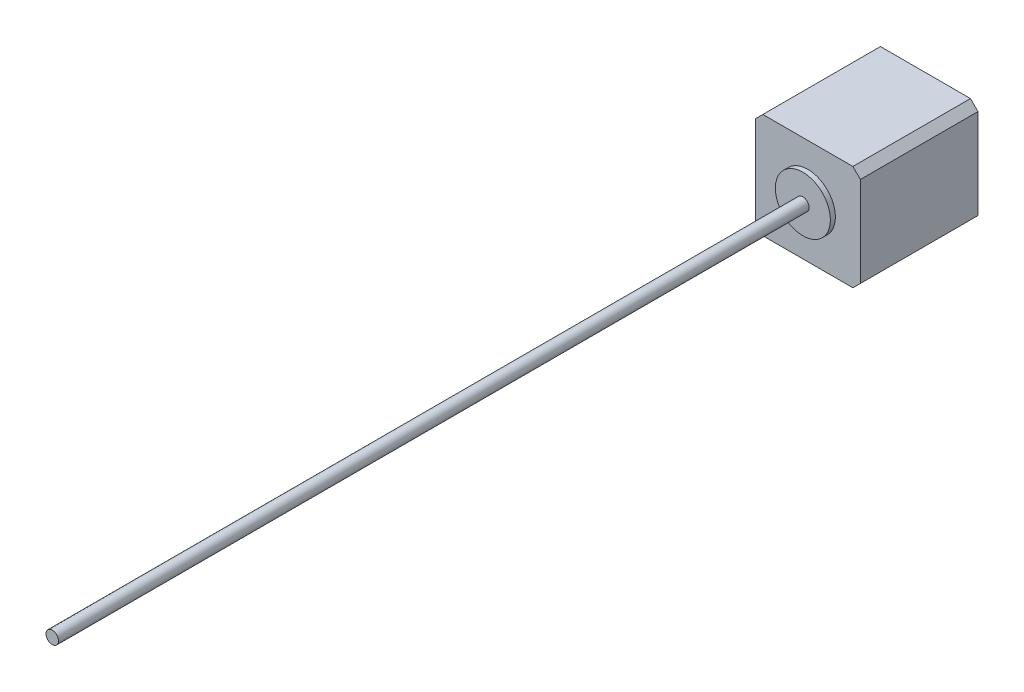
ISO-10303-21;
HEADER;
FILE_DESCRIPTION(('STEP AP214'),'2;1');
FILE_NAME('part.step','',(''),(''),'','','');
FILE_SCHEMA(('AUTOMOTIVE_DESIGN { 1 0 10303 214 1 1 1 1 }'));
ENDSEC;
DATA;
#1=APPLICATION_CONTEXT('core data for automotive mechanical design processes');
#2=APPLICATION_PROTOCOL_DEFINITION('international standard','automotive_design',2000,#1);
#3=PRODUCT_CONTEXT('',#1,'mechanical');
#4=PRODUCT('Part','Part','',(#3));
#5=PRODUCT_RELATED_PRODUCT_CATEGORY('part','',(#4));
#6=PRODUCT_DEFINITION_FORMATION('','',#4);
#7=PRODUCT_DEFINITION_CONTEXT('part definition',#1,'design');
#8=PRODUCT_DEFINITION('design','',#6,#7);
#9=PRODUCT_DEFINITION_SHAPE('','',#8);
#10=(LENGTH_UNIT() NAMED_UNIT(*) SI_UNIT(.MILLI.,.METRE.));
#11=(NAMED_UNIT(*) PLANE_ANGLE_UNIT() SI_UNIT($,.RADIAN.));
#12=(NAMED_UNIT(*) SI_UNIT($,.STERADIAN.) SOLID_ANGLE_UNIT());
#13=UNCERTAINTY_MEASURE_WITH_UNIT(LENGTH_MEASURE(1.E-05),#10,'distance_accuracy_value','');
#14=(GEOMETRIC_REPRESENTATION_CONTEXT(3) GLOBAL_UNCERTAINTY_ASSIGNED_CONTEXT((#13)) GLOBAL_UNIT_ASSIGNED_CONTEXT((#10,
#11,#12)) REPRESENTATION_CONTEXT('',''));
#15=CARTESIAN_POINT('',(0.,0.,0.));
#16=DIRECTION('',(0.,0.,1.));
#17=DIRECTION('',(1.,0.,0.));
#18=AXIS2_PLACEMENT_3D('',#15,#16,#17);
#19=CARTESIAN_POINT('',(-21.,21.,49.));
#20=DIRECTION('',(0.,0.,1.));
#21=DIRECTION('',(1.,0.,0.));
#22=AXIS2_PLACEMENT_3D('',#19,#20,#21);
#23=PLANE('',#22);
#24=CARTESIAN_POINT('',(-21.,21.,49.));
#25=DIRECTION('',(0.,0.,1.));
#26=DIRECTION('',(1.,0.,0.));
#27=AXIS2_PLACEMENT_3D('',#24,#25,#26);
#28=CIRCLE('',#27,11.);
#29=CARTESIAN_POINT('',(-10.,21.,49.));
#30=VERTEX_POINT('',#29);
#31=EDGE_CURVE('E161',#30,#30,#28,.T.);
#32=ORIENTED_EDGE('',*,*,#31,.T.);
#33=EDGE_LOOP('',(#32));
#34=FACE_BOUND('',#33,.T.);
#35=CARTESIAN_POINT('',(-21.,21.,49.));
#36=DIRECTION('',(0.,0.,1.));
#37=DIRECTION('',(1.,0.,0.));
#38=AXIS2_PLACEMENT_3D('',#35,#36,#37);
#39=CIRCLE('',#38,2.5);
#40=CARTESIAN_POINT('',(-18.5,21.,49.));
#41=VERTEX_POINT('',#40);
#42=EDGE_CURVE('E175',#41,#41,#39,.T.);
#43=ORIENTED_EDGE('',*,*,#42,.F.);
#44=EDGE_LOOP('',(#43));
#45=FACE_BOUND('',#44,.T.);
#46=ADVANCED_FACE('F35',(#34,#45),#23,.T.);
#47=CARTESIAN_POINT('',(0.,0.,47.));
#48=DIRECTION('',(0.,0.,1.));
#49=DIRECTION('',(1.,0.,0.));
#50=AXIS2_PLACEMENT_3D('',#47,#48,#49);
#51=PLANE('',#50);
#52=DIRECTION('',(0.,-1.,0.));
#53=VECTOR('',#52,1.);
#54=CARTESIAN_POINT('',(-42.,0.,47.));
#55=LINE('',#54,#53);
#56=CARTESIAN_POINT('',(-42.,39.,47.));
#57=VERTEX_POINT('',#56);
#58=CARTESIAN_POINT('',(-42.,3.00000000000001,47.));
#59=VERTEX_POINT('',#58);
#60=EDGE_CURVE('E165',#57,#59,#55,.T.);
#61=ORIENTED_EDGE('',*,*,#60,.T.);
#62=DIRECTION('',(-0.707106781186545,0.70710678118655,0.));
#63=VECTOR('',#62,1.);
#64=CARTESIAN_POINT('',(-19.5000000000001,-19.5,47.));
#65=LINE('',#64,#63);
#66=CARTESIAN_POINT('',(-39.,0.,47.));
#67=VERTEX_POINT('',#66);
#68=EDGE_CURVE('E148',#59,#67,#65,.F.);
#69=ORIENTED_EDGE('',*,*,#68,.T.);
#70=DIRECTION('',(1.,0.,0.));
#71=VECTOR('',#70,1.);
#72=CARTESIAN_POINT('',(0.,0.,47.));
#73=LINE('',#72,#71);
#74=CARTESIAN_POINT('',(-3.00000000000001,0.,47.));
#75=VERTEX_POINT('',#74);
#76=EDGE_CURVE('E120',#67,#75,#73,.T.);
#77=ORIENTED_EDGE('',*,*,#76,.T.);
#78=DIRECTION('',(-0.70710678118655,-0.707106781186545,0.));
#79=VECTOR('',#78,1.);
#80=CARTESIAN_POINT('',(-1.49999999999999,1.5,47.));
#81=LINE('',#80,#79);
#82=CARTESIAN_POINT('',(0.,2.99999999999999,47.));
#83=VERTEX_POINT('',#82);
#84=EDGE_CURVE('E146',#75,#83,#81,.F.);
#85=ORIENTED_EDGE('',*,*,#84,.T.);
#86=DIRECTION('',(0.,1.,0.));
#87=VECTOR('',#86,1.);
#88=CARTESIAN_POINT('',(0.,0.,47.));
#89=LINE('',#88,#87);
#90=CARTESIAN_POINT('',(0.,39.,47.));
#91=VERTEX_POINT('',#90);
#92=EDGE_CURVE('E126',#83,#91,#89,.T.);
#93=ORIENTED_EDGE('',*,*,#92,.T.);
#94=DIRECTION('',(0.707106781186546,-0.707106781186549,0.));
#95=VECTOR('',#94,1.);
#96=CARTESIAN_POINT('',(19.5,19.4999999999999,47.));
#97=LINE('',#96,#95);
#98=CARTESIAN_POINT('',(-3.,42.,47.));
#99=VERTEX_POINT('',#98);
#100=EDGE_CURVE('E55',#91,#99,#97,.F.);
#101=ORIENTED_EDGE('',*,*,#100,.T.);
#102=DIRECTION('',(-1.,0.,0.));
#103=VECTOR('',#102,1.);
#104=CARTESIAN_POINT('',(0.,42.,47.));
#105=LINE('',#104,#103);
#106=CARTESIAN_POINT('',(-39.,42.,47.));
#107=VERTEX_POINT('',#106);
#108=EDGE_CURVE('E129',#99,#107,#105,.T.);
#109=ORIENTED_EDGE('',*,*,#108,.T.);
#110=DIRECTION('',(0.707106781186551,0.707106781186544,0.));
#111=VECTOR('',#110,1.);
#112=CARTESIAN_POINT('',(-40.4999999999998,40.5000000000002,47.));
#113=LINE('',#112,#111);
#114=EDGE_CURVE('E144',#107,#57,#113,.F.);
#115=ORIENTED_EDGE('',*,*,#114,.T.);
#116=EDGE_LOOP('',(#61,#69,#77,#85,#93,#101,#109,#115));
#117=FACE_BOUND('',#116,.T.);
#118=CARTESIAN_POINT('',(-21.,21.,47.));
#119=DIRECTION('',(0.,0.,1.));
#120=DIRECTION('',(1.,0.,0.));
#121=AXIS2_PLACEMENT_3D('',#118,#119,#120);
#122=CIRCLE('',#121,11.);
#123=CARTESIAN_POINT('',(-10.,21.,47.));
#124=VERTEX_POINT('',#123);
#125=EDGE_CURVE('E169',#124,#124,#122,.T.);
#126=ORIENTED_EDGE('',*,*,#125,.F.);
#127=EDGE_LOOP('',(#126));
#128=FACE_BOUND('',#127,.T.);
#129=ADVANCED_FACE('F191',(#117,#128),#51,.T.);
#130=CARTESIAN_POINT('',(0.,0.,47.));
#131=DIRECTION('',(-1.,0.,0.));
#132=DIRECTION('',(0.,0.,1.));
#133=AXIS2_PLACEMENT_3D('',#130,#131,#132);
#134=PLANE('',#133);
#135=ORIENTED_EDGE('',*,*,#92,.F.);
#136=DIRECTION('',(0.,0.,-1.));
#137=VECTOR('',#136,1.);
#138=CARTESIAN_POINT('',(0.,2.99999999999999,47.));
#139=LINE('',#138,#137);
#140=CARTESIAN_POINT('',(0.,2.99999999999999,0.));
#141=VERTEX_POINT('',#140);
#142=EDGE_CURVE('E152',#83,#141,#139,.T.);
#143=ORIENTED_EDGE('',*,*,#142,.T.);
#144=DIRECTION('',(0.,1.,0.));
#145=VECTOR('',#144,1.);
#146=CARTESIAN_POINT('',(0.,0.,0.));
#147=LINE('',#146,#145);
#148=CARTESIAN_POINT('',(0.,39.,0.));
#149=VERTEX_POINT('',#148);
#150=EDGE_CURVE('E160',#141,#149,#147,.T.);
#151=ORIENTED_EDGE('',*,*,#150,.T.);
#152=DIRECTION('',(0.,0.,1.));
#153=VECTOR('',#152,1.);
#154=CARTESIAN_POINT('',(0.,39.,47.));
#155=LINE('',#154,#153);
#156=EDGE_CURVE('E150',#149,#91,#155,.T.);
#157=ORIENTED_EDGE('',*,*,#156,.T.);
#158=EDGE_LOOP('',(#135,#143,#151,#157));
#159=FACE_BOUND('',#158,.T.);
#160=ADVANCED_FACE('F197',(#159),#134,.F.);
#161=CARTESIAN_POINT('',(0.,42.,47.));
#162=DIRECTION('',(0.,-1.,0.));
#163=DIRECTION('',(0.,0.,-1.));
#164=AXIS2_PLACEMENT_3D('',#161,#162,#163);
#165=PLANE('',#164);
#166=DIRECTION('',(-1.,0.,0.));
#167=VECTOR('',#166,1.);
#168=CARTESIAN_POINT('',(0.,42.,0.));
#169=LINE('',#168,#167);
#170=CARTESIAN_POINT('',(-3.,42.,0.));
#171=VERTEX_POINT('',#170);
#172=CARTESIAN_POINT('',(-39.,42.,0.));
#173=VERTEX_POINT('',#172);
#174=EDGE_CURVE('E131',#171,#173,#169,.T.);
#175=ORIENTED_EDGE('',*,*,#174,.T.);
#176=DIRECTION('',(0.,0.,1.));
#177=VECTOR('',#176,1.);
#178=CARTESIAN_POINT('',(-39.,42.,47.));
#179=LINE('',#178,#177);
#180=EDGE_CURVE('E11',#173,#107,#179,.T.);
#181=ORIENTED_EDGE('',*,*,#180,.T.);
#182=ORIENTED_EDGE('',*,*,#108,.F.);
#183=DIRECTION('',(0.,0.,-1.));
#184=VECTOR('',#183,1.);
#185=CARTESIAN_POINT('',(-3.,42.,47.));
#186=LINE('',#185,#184);
#187=EDGE_CURVE('E43',#99,#171,#186,.T.);
#188=ORIENTED_EDGE('',*,*,#187,.T.);
#189=EDGE_LOOP('',(#175,#181,#182,#188));
#190=FACE_BOUND('',#189,.T.);
#191=ADVANCED_FACE('F157',(#190),#165,.F.);
#192=CARTESIAN_POINT('',(-42.,0.,47.));
#193=DIRECTION('',(1.,0.,0.));
#194=DIRECTION('',(0.,0.,-1.));
#195=AXIS2_PLACEMENT_3D('',#192,#193,#194);
#196=PLANE('',#195);
#197=DIRECTION('',(0.,-1.,0.));
#198=VECTOR('',#197,1.);
#199=CARTESIAN_POINT('',(-42.,0.,0.));
#200=LINE('',#199,#198);
#201=CARTESIAN_POINT('',(-42.,39.,0.));
#202=VERTEX_POINT('',#201);
#203=CARTESIAN_POINT('',(-42.,3.00000000000001,0.));
#204=VERTEX_POINT('',#203);
#205=EDGE_CURVE('E127',#202,#204,#200,.T.);
#206=ORIENTED_EDGE('',*,*,#205,.T.);
#207=DIRECTION('',(0.,0.,1.));
#208=VECTOR('',#207,1.);
#209=CARTESIAN_POINT('',(-42.,3.00000000000001,47.));
#210=LINE('',#209,#208);
#211=EDGE_CURVE('E105',#204,#59,#210,.T.);
#212=ORIENTED_EDGE('',*,*,#211,.T.);
#213=ORIENTED_EDGE('',*,*,#60,.F.);
#214=DIRECTION('',(0.,0.,-1.));
#215=VECTOR('',#214,1.);
#216=CARTESIAN_POINT('',(-42.,39.,47.));
#217=LINE('',#216,#215);
#218=EDGE_CURVE('E110',#57,#202,#217,.T.);
#219=ORIENTED_EDGE('',*,*,#218,.T.);
#220=EDGE_LOOP('',(#206,#212,#213,#219));
#221=FACE_BOUND('',#220,.T.);
#222=ADVANCED_FACE('F208',(#221),#196,.F.);
#223=CARTESIAN_POINT('',(0.,0.,47.));
#224=DIRECTION('',(0.,1.,0.));
#225=DIRECTION('',(-1.,0.,0.));
#226=AXIS2_PLACEMENT_3D('',#223,#224,#225);
#227=PLANE('',#226);
#228=ORIENTED_EDGE('',*,*,#76,.F.);
#229=DIRECTION('',(0.,0.,-1.));
#230=VECTOR('',#229,1.);
#231=CARTESIAN_POINT('',(-39.,0.,47.));
#232=LINE('',#231,#230);
#233=CARTESIAN_POINT('',(-39.,0.,0.));
#234=VERTEX_POINT('',#233);
#235=EDGE_CURVE('E104',#67,#234,#232,.T.);
#236=ORIENTED_EDGE('',*,*,#235,.T.);
#237=DIRECTION('',(1.,0.,0.));
#238=VECTOR('',#237,1.);
#239=CARTESIAN_POINT('',(0.,0.,0.));
#240=LINE('',#239,#238);
#241=CARTESIAN_POINT('',(-3.00000000000001,0.,0.));
#242=VERTEX_POINT('',#241);
#243=EDGE_CURVE('E117',#234,#242,#240,.T.);
#244=ORIENTED_EDGE('',*,*,#243,.T.);
#245=DIRECTION('',(0.,0.,1.));
#246=VECTOR('',#245,1.);
#247=CARTESIAN_POINT('',(-3.00000000000001,0.,47.));
#248=LINE('',#247,#246);
#249=EDGE_CURVE('E122',#242,#75,#248,.T.);
#250=ORIENTED_EDGE('',*,*,#249,.T.);
#251=EDGE_LOOP('',(#228,#236,#244,#250));
#252=FACE_BOUND('',#251,.T.);
#253=ADVANCED_FACE('F116',(#252),#227,.F.);
#254=CARTESIAN_POINT('',(0.,0.,0.));
#255=DIRECTION('',(0.,0.,1.));
#256=DIRECTION('',(1.,0.,0.));
#257=AXIS2_PLACEMENT_3D('',#254,#255,#256);
#258=PLANE('',#257);
#259=ORIENTED_EDGE('',*,*,#243,.F.);
#260=DIRECTION('',(0.707106781186545,-0.70710678118655,0.));
#261=VECTOR('',#260,1.);
#262=CARTESIAN_POINT('',(-39.,0.,0.));
#263=LINE('',#262,#261);
#264=EDGE_CURVE('E100',#234,#204,#263,.F.);
#265=ORIENTED_EDGE('',*,*,#264,.T.);
#266=ORIENTED_EDGE('',*,*,#205,.F.);
#267=DIRECTION('',(-0.707106781186551,-0.707106781186544,0.));
#268=VECTOR('',#267,1.);
#269=CARTESIAN_POINT('',(-42.,39.,0.));
#270=LINE('',#269,#268);
#271=EDGE_CURVE('E137',#202,#173,#270,.F.);
#272=ORIENTED_EDGE('',*,*,#271,.T.);
#273=ORIENTED_EDGE('',*,*,#174,.F.);
#274=DIRECTION('',(-0.707106781186546,0.707106781186549,0.));
#275=VECTOR('',#274,1.);
#276=CARTESIAN_POINT('',(-3.,42.,0.));
#277=LINE('',#276,#275);
#278=EDGE_CURVE('E121',#171,#149,#277,.F.);
#279=ORIENTED_EDGE('',*,*,#278,.T.);
#280=ORIENTED_EDGE('',*,*,#150,.F.);
#281=DIRECTION('',(0.70710678118655,0.707106781186545,0.));
#282=VECTOR('',#281,1.);
#283=CARTESIAN_POINT('',(0.,2.99999999999999,0.));
#284=LINE('',#283,#282);
#285=EDGE_CURVE('E111',#141,#242,#284,.F.);
#286=ORIENTED_EDGE('',*,*,#285,.T.);
#287=EDGE_LOOP('',(#259,#265,#266,#272,#273,#279,#280,#286));
#288=FACE_BOUND('',#287,.T.);
#289=ADVANCED_FACE('F124',(#288),#258,.F.);
#290=CARTESIAN_POINT('',(-39.,0.,47.));
#291=DIRECTION('',(0.70710678118655,0.707106781186545,0.));
#292=DIRECTION('',(0.,0.,-1.));
#293=AXIS2_PLACEMENT_3D('',#290,#291,#292);
#294=PLANE('',#293);
#295=ORIENTED_EDGE('',*,*,#68,.F.);
#296=ORIENTED_EDGE('',*,*,#211,.F.);
#297=ORIENTED_EDGE('',*,*,#264,.F.);
#298=ORIENTED_EDGE('',*,*,#235,.F.);
#299=EDGE_LOOP('',(#295,#296,#297,#298));
#300=FACE_BOUND('',#299,.T.);
#301=ADVANCED_FACE('F103',(#300),#294,.F.);
#302=CARTESIAN_POINT('',(0.,2.99999999999999,47.));
#303=DIRECTION('',(-0.707106781186545,0.70710678118655,0.));
#304=DIRECTION('',(0.,0.,-1.));
#305=AXIS2_PLACEMENT_3D('',#302,#303,#304);
#306=PLANE('',#305);
#307=ORIENTED_EDGE('',*,*,#84,.F.);
#308=ORIENTED_EDGE('',*,*,#249,.F.);
#309=ORIENTED_EDGE('',*,*,#285,.F.);
#310=ORIENTED_EDGE('',*,*,#142,.F.);
#311=EDGE_LOOP('',(#307,#308,#309,#310));
#312=FACE_BOUND('',#311,.T.);
#313=ADVANCED_FACE('F219',(#312),#306,.F.);
#314=CARTESIAN_POINT('',(-42.,39.,47.));
#315=DIRECTION('',(0.707106781186544,-0.707106781186551,0.));
#316=DIRECTION('',(0.,0.,-1.));
#317=AXIS2_PLACEMENT_3D('',#314,#315,#316);
#318=PLANE('',#317);
#319=ORIENTED_EDGE('',*,*,#114,.F.);
#320=ORIENTED_EDGE('',*,*,#180,.F.);
#321=ORIENTED_EDGE('',*,*,#271,.F.);
#322=ORIENTED_EDGE('',*,*,#218,.F.);
#323=EDGE_LOOP('',(#319,#320,#321,#322));
#324=FACE_BOUND('',#323,.T.);
#325=ADVANCED_FACE('F221',(#324),#318,.F.);
#326=CARTESIAN_POINT('',(-3.,42.,47.));
#327=DIRECTION('',(-0.707106781186549,-0.707106781186546,0.));
#328=DIRECTION('',(0.,0.,-1.));
#329=AXIS2_PLACEMENT_3D('',#326,#327,#328);
#330=PLANE('',#329);
#331=ORIENTED_EDGE('',*,*,#100,.F.);
#332=ORIENTED_EDGE('',*,*,#156,.F.);
#333=ORIENTED_EDGE('',*,*,#278,.F.);
#334=ORIENTED_EDGE('',*,*,#187,.F.);
#335=EDGE_LOOP('',(#331,#332,#333,#334));
#336=FACE_BOUND('',#335,.T.);
#337=ADVANCED_FACE('F37',(#336),#330,.F.);
#338=CARTESIAN_POINT('',(-21.,21.,49.));
#339=DIRECTION('',(0.,0.,-1.));
#340=DIRECTION('',(-1.,0.,0.));
#341=AXIS2_PLACEMENT_3D('',#338,#339,#340);
#342=CYLINDRICAL_SURFACE('',#341,11.);
#343=ORIENTED_EDGE('',*,*,#31,.F.);
#344=EDGE_LOOP('',(#343));
#345=FACE_BOUND('',#344,.T.);
#346=ORIENTED_EDGE('',*,*,#125,.T.);
#347=EDGE_LOOP('',(#346));
#348=FACE_BOUND('',#347,.T.);
#349=ADVANCED_FACE('F186',(#345,#348),#342,.T.);
#350=CARTESIAN_POINT('',(-21.,21.,349.));
#351=DIRECTION('',(0.,0.,-1.));
#352=DIRECTION('',(-1.,0.,0.));
#353=AXIS2_PLACEMENT_3D('',#350,#351,#352);
#354=CYLINDRICAL_SURFACE('',#353,2.5);
#355=CARTESIAN_POINT('',(-21.,21.,349.));
#356=DIRECTION('',(0.,0.,1.));
#357=DIRECTION('',(1.,0.,0.));
#358=AXIS2_PLACEMENT_3D('',#355,#356,#357);
#359=CIRCLE('',#358,2.5);
#360=CARTESIAN_POINT('',(-18.5,21.,349.));
#361=VERTEX_POINT('',#360);
#362=EDGE_CURVE('E172',#361,#361,#359,.T.);
#363=ORIENTED_EDGE('',*,*,#362,.F.);
#364=EDGE_LOOP('',(#363));
#365=FACE_BOUND('',#364,.T.);
#366=ORIENTED_EDGE('',*,*,#42,.T.);
#367=EDGE_LOOP('',(#366));
#368=FACE_BOUND('',#367,.T.);
#369=ADVANCED_FACE('F183',(#365,#368),#354,.T.);
#370=CARTESIAN_POINT('',(-21.,21.,349.));
#371=DIRECTION('',(0.,0.,1.));
#372=DIRECTION('',(1.,0.,0.));
#373=AXIS2_PLACEMENT_3D('',#370,#371,#372);
#374=PLANE('',#373);
#375=ORIENTED_EDGE('',*,*,#362,.T.);
#376=EDGE_LOOP('',(#375));
#377=FACE_BOUND('',#376,.T.);
#378=ADVANCED_FACE('F181',(#377),#374,.T.);
#379=CLOSED_SHELL('',(#46,#129,#160,#191,#222,#253,#289,#301,#313,#325,#337,#349,#369,#378));
#380=MANIFOLD_SOLID_BREP('B2',#379);
#381=ADVANCED_BREP_SHAPE_REPRESENTATION('',(#18,#380),#14);
#382=SHAPE_DEFINITION_REPRESENTATION(#9,#381);
ENDSEC;
END-ISO-10303-21;
